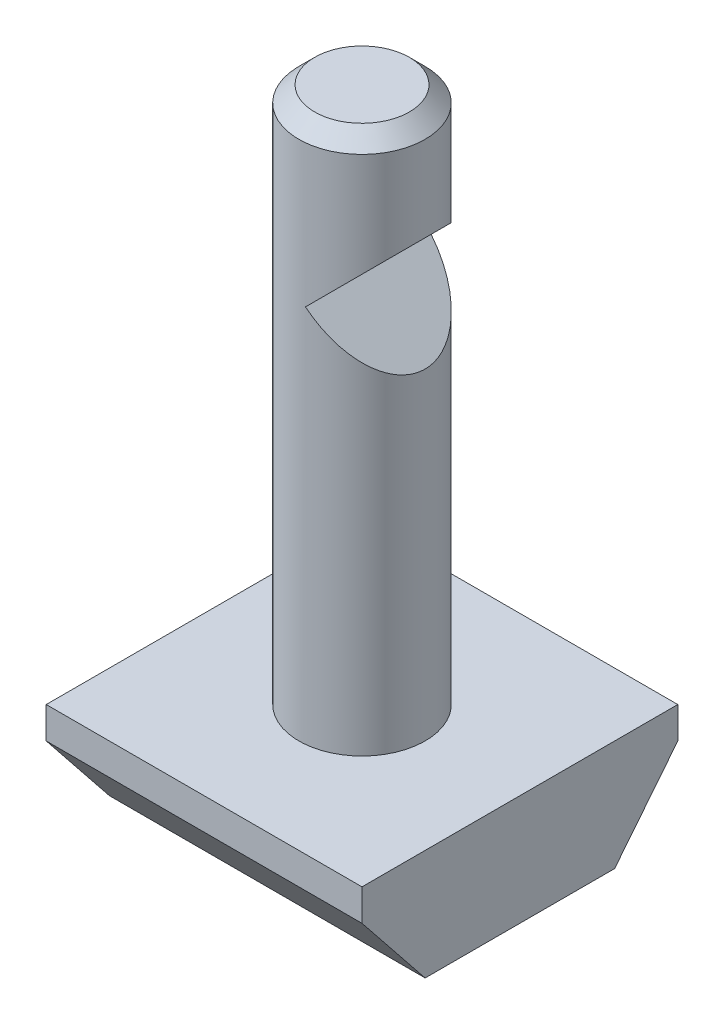
ISO-10303-21;
HEADER;
FILE_DESCRIPTION(('STEP AP214'),'2;1');
FILE_NAME('part.step','',(''),(''),'','','');
FILE_SCHEMA(('AUTOMOTIVE_DESIGN { 1 0 10303 214 1 1 1 1 }'));
ENDSEC;
DATA;
#1=APPLICATION_CONTEXT('core data for automotive mechanical design processes');
#2=APPLICATION_PROTOCOL_DEFINITION('international standard','automotive_design',2000,#1);
#3=PRODUCT_CONTEXT('',#1,'mechanical');
#4=PRODUCT('Part','Part','',(#3));
#5=PRODUCT_RELATED_PRODUCT_CATEGORY('part','',(#4));
#6=PRODUCT_DEFINITION_FORMATION('','',#4);
#7=PRODUCT_DEFINITION_CONTEXT('part definition',#1,'design');
#8=PRODUCT_DEFINITION('design','',#6,#7);
#9=PRODUCT_DEFINITION_SHAPE('','',#8);
#10=(LENGTH_UNIT() NAMED_UNIT(*) SI_UNIT(.MILLI.,.METRE.));
#11=(NAMED_UNIT(*) PLANE_ANGLE_UNIT() SI_UNIT($,.RADIAN.));
#12=(NAMED_UNIT(*) SI_UNIT($,.STERADIAN.) SOLID_ANGLE_UNIT());
#13=UNCERTAINTY_MEASURE_WITH_UNIT(LENGTH_MEASURE(1.E-05),#10,'distance_accuracy_value','');
#14=(GEOMETRIC_REPRESENTATION_CONTEXT(3) GLOBAL_UNCERTAINTY_ASSIGNED_CONTEXT((#13)) GLOBAL_UNIT_ASSIGNED_CONTEXT((#10,
#11,#12)) REPRESENTATION_CONTEXT('',''));
#15=CARTESIAN_POINT('',(0.,0.,0.));
#16=DIRECTION('',(0.,0.,1.));
#17=DIRECTION('',(1.,0.,0.));
#18=AXIS2_PLACEMENT_3D('',#15,#16,#17);
#19=CARTESIAN_POINT('',(5.,-1.,-5.));
#20=DIRECTION('',(0.,0.624695047554424,0.78086880944303));
#21=DIRECTION('',(0.,-0.78086880944303,0.624695047554424));
#22=AXIS2_PLACEMENT_3D('',#19,#20,#21);
#23=PLANE('',#22);
#24=DIRECTION('',(1.,0.,0.));
#25=VECTOR('',#24,1.);
#26=CARTESIAN_POINT('',(5.,-1.,-5.));
#27=LINE('',#26,#25);
#28=CARTESIAN_POINT('',(-5.,-1.,-5.));
#29=VERTEX_POINT('',#28);
#30=CARTESIAN_POINT('',(5.,-1.,-5.));
#31=VERTEX_POINT('',#30);
#32=EDGE_CURVE('E79',#29,#31,#27,.T.);
#33=ORIENTED_EDGE('',*,*,#32,.T.);
#34=DIRECTION('',(0.,-0.78086880944303,0.624695047554424));
#35=VECTOR('',#34,1.);
#36=CARTESIAN_POINT('',(5.,-1.,-5.));
#37=LINE('',#36,#35);
#38=CARTESIAN_POINT('',(5.,-3.5,-3.));
#39=VERTEX_POINT('',#38);
#40=EDGE_CURVE('E98',#31,#39,#37,.T.);
#41=ORIENTED_EDGE('',*,*,#40,.T.);
#42=DIRECTION('',(1.,0.,0.));
#43=VECTOR('',#42,1.);
#44=CARTESIAN_POINT('',(5.,-3.5,-3.));
#45=LINE('',#44,#43);
#46=CARTESIAN_POINT('',(-5.,-3.5,-3.));
#47=VERTEX_POINT('',#46);
#48=EDGE_CURVE('E91',#39,#47,#45,.F.);
#49=ORIENTED_EDGE('',*,*,#48,.T.);
#50=DIRECTION('',(0.,-0.78086880944303,0.624695047554424));
#51=VECTOR('',#50,1.);
#52=CARTESIAN_POINT('',(-5.,-1.,-5.));
#53=LINE('',#52,#51);
#54=EDGE_CURVE('E114',#29,#47,#53,.T.);
#55=ORIENTED_EDGE('',*,*,#54,.F.);
#56=EDGE_LOOP('',(#33,#41,#49,#55));
#57=FACE_BOUND('',#56,.T.);
#58=ADVANCED_FACE('F15',(#57),#23,.F.);
#59=CARTESIAN_POINT('',(5.,-3.5,-3.));
#60=DIRECTION('',(0.,1.,0.));
#61=DIRECTION('',(0.,0.,1.));
#62=AXIS2_PLACEMENT_3D('',#59,#60,#61);
#63=PLANE('',#62);
#64=ORIENTED_EDGE('',*,*,#48,.F.);
#65=DIRECTION('',(0.,0.,1.));
#66=VECTOR('',#65,1.);
#67=CARTESIAN_POINT('',(5.,-3.5,0.));
#68=LINE('',#67,#66);
#69=CARTESIAN_POINT('',(5.,-3.5,3.));
#70=VERTEX_POINT('',#69);
#71=EDGE_CURVE('E100',#39,#70,#68,.T.);
#72=ORIENTED_EDGE('',*,*,#71,.T.);
#73=DIRECTION('',(1.,0.,0.));
#74=VECTOR('',#73,1.);
#75=CARTESIAN_POINT('',(5.,-3.5,3.));
#76=LINE('',#75,#74);
#77=CARTESIAN_POINT('',(-5.,-3.5,3.));
#78=VERTEX_POINT('',#77);
#79=EDGE_CURVE('E80',#70,#78,#76,.F.);
#80=ORIENTED_EDGE('',*,*,#79,.T.);
#81=DIRECTION('',(0.,0.,1.));
#82=VECTOR('',#81,1.);
#83=CARTESIAN_POINT('',(-5.,-3.5,0.));
#84=LINE('',#83,#82);
#85=EDGE_CURVE('E117',#47,#78,#84,.T.);
#86=ORIENTED_EDGE('',*,*,#85,.F.);
#87=EDGE_LOOP('',(#64,#72,#80,#86));
#88=FACE_BOUND('',#87,.T.);
#89=ADVANCED_FACE('F150',(#88),#63,.F.);
#90=CARTESIAN_POINT('',(5.,-3.5,3.));
#91=DIRECTION('',(0.,0.624695047554424,-0.78086880944303));
#92=DIRECTION('',(0.,0.78086880944303,0.624695047554424));
#93=AXIS2_PLACEMENT_3D('',#90,#91,#92);
#94=PLANE('',#93);
#95=ORIENTED_EDGE('',*,*,#79,.F.);
#96=DIRECTION('',(0.,0.78086880944303,0.624695047554425));
#97=VECTOR('',#96,1.);
#98=CARTESIAN_POINT('',(5.,-3.5,3.));
#99=LINE('',#98,#97);
#100=CARTESIAN_POINT('',(5.,-1.,5.));
#101=VERTEX_POINT('',#100);
#102=EDGE_CURVE('E102',#70,#101,#99,.T.);
#103=ORIENTED_EDGE('',*,*,#102,.T.);
#104=DIRECTION('',(-1.,0.,0.));
#105=VECTOR('',#104,1.);
#106=CARTESIAN_POINT('',(5.,-1.,5.));
#107=LINE('',#106,#105);
#108=CARTESIAN_POINT('',(-5.,-1.,5.));
#109=VERTEX_POINT('',#108);
#110=EDGE_CURVE('E107',#101,#109,#107,.T.);
#111=ORIENTED_EDGE('',*,*,#110,.T.);
#112=DIRECTION('',(0.,0.78086880944303,0.624695047554425));
#113=VECTOR('',#112,1.);
#114=CARTESIAN_POINT('',(-5.,-3.5,3.));
#115=LINE('',#114,#113);
#116=EDGE_CURVE('E89',#78,#109,#115,.T.);
#117=ORIENTED_EDGE('',*,*,#116,.F.);
#118=EDGE_LOOP('',(#95,#103,#111,#117));
#119=FACE_BOUND('',#118,.T.);
#120=ADVANCED_FACE('F154',(#119),#94,.F.);
#121=CARTESIAN_POINT('',(0.,17.,0.));
#122=DIRECTION('',(0.,1.,0.));
#123=DIRECTION('',(0.,0.,1.));
#124=AXIS2_PLACEMENT_3D('',#121,#122,#123);
#125=PLANE('',#124);
#126=CARTESIAN_POINT('',(0.,16.9999999999959,0.));
#127=DIRECTION('',(0.,-1.,0.));
#128=DIRECTION('',(0.,0.,-1.));
#129=AXIS2_PLACEMENT_3D('',#126,#127,#128);
#130=CIRCLE('',#129,1.49999999996453);
#131=CARTESIAN_POINT('',(0.,16.9999999999959,-1.49999999996453));
#132=VERTEX_POINT('',#131);
#133=EDGE_CURVE('E18',#132,#132,#130,.T.);
#134=ORIENTED_EDGE('',*,*,#133,.F.);
#135=EDGE_LOOP('',(#134));
#136=FACE_BOUND('',#135,.T.);
#137=ADVANCED_FACE('F185',(#136),#125,.T.);
#138=CARTESIAN_POINT('',(2.,10.2,5.));
#139=DIRECTION('',(-0.707106781186547,-0.707106781186548,0.));
#140=DIRECTION('',(0.707106781186548,-0.707106781186547,0.));
#141=AXIS2_PLACEMENT_3D('',#138,#139,#140);
#142=PLANE('',#141);
#143=DIRECTION('',(0.,0.,1.));
#144=VECTOR('',#143,1.);
#145=CARTESIAN_POINT('',(0.2,12.,5.));
#146=LINE('',#145,#144);
#147=CARTESIAN_POINT('',(0.2,12.,-1.98997487421324));
#148=VERTEX_POINT('',#147);
#149=CARTESIAN_POINT('',(0.2,12.,1.98997487421324));
#150=VERTEX_POINT('',#149);
#151=EDGE_CURVE('E74',#148,#150,#146,.T.);
#152=ORIENTED_EDGE('',*,*,#151,.T.);
#153=CARTESIAN_POINT('',(0.,12.2,0.));
#154=DIRECTION('',(-0.707106781186547,-0.707106781186548,0.));
#155=DIRECTION('',(0.707106781186548,-0.707106781186547,0.));
#156=AXIS2_PLACEMENT_3D('',#153,#154,#155);
#157=ELLIPSE('',#156,2.82842712474619,2.);
#158=EDGE_CURVE('E72',#148,#150,#157,.T.);
#159=ORIENTED_EDGE('',*,*,#158,.F.);
#160=EDGE_LOOP('',(#152,#159));
#161=FACE_BOUND('',#160,.T.);
#162=ADVANCED_FACE('F76',(#161),#142,.F.);
#163=CARTESIAN_POINT('',(0.2,12.,5.));
#164=DIRECTION('',(-0.707106781186547,0.707106781186548,0.));
#165=DIRECTION('',(-0.707106781186548,-0.707106781186547,0.));
#166=AXIS2_PLACEMENT_3D('',#163,#164,#165);
#167=PLANE('',#166);
#168=CARTESIAN_POINT('',(0.,11.8,0.));
#169=DIRECTION('',(-0.707106781186547,0.707106781186548,0.));
#170=DIRECTION('',(-0.707106781186548,-0.707106781186547,0.));
#171=AXIS2_PLACEMENT_3D('',#168,#169,#170);
#172=ELLIPSE('',#171,2.82842712474619,2.);
#173=EDGE_CURVE('E82',#150,#148,#172,.T.);
#174=ORIENTED_EDGE('',*,*,#173,.F.);
#175=ORIENTED_EDGE('',*,*,#151,.F.);
#176=EDGE_LOOP('',(#174,#175));
#177=FACE_BOUND('',#176,.T.);
#178=ADVANCED_FACE('F83',(#177),#167,.F.);
#179=CARTESIAN_POINT('',(5.,0.,-5.));
#180=DIRECTION('',(0.,0.,1.));
#181=DIRECTION('',(1.,0.,0.));
#182=AXIS2_PLACEMENT_3D('',#179,#180,#181);
#183=PLANE('',#182);
#184=DIRECTION('',(1.,0.,0.));
#185=VECTOR('',#184,1.);
#186=CARTESIAN_POINT('',(5.,0.,-5.));
#187=LINE('',#186,#185);
#188=CARTESIAN_POINT('',(-5.,0.,-5.));
#189=VERTEX_POINT('',#188);
#190=CARTESIAN_POINT('',(5.,0.,-5.));
#191=VERTEX_POINT('',#190);
#192=EDGE_CURVE('E85',#189,#191,#187,.T.);
#193=ORIENTED_EDGE('',*,*,#192,.T.);
#194=DIRECTION('',(0.,1.,0.));
#195=VECTOR('',#194,1.);
#196=CARTESIAN_POINT('',(5.,0.,-5.));
#197=LINE('',#196,#195);
#198=EDGE_CURVE('E95',#191,#31,#197,.F.);
#199=ORIENTED_EDGE('',*,*,#198,.T.);
#200=ORIENTED_EDGE('',*,*,#32,.F.);
#201=DIRECTION('',(0.,1.,0.));
#202=VECTOR('',#201,1.);
#203=CARTESIAN_POINT('',(-5.,0.,-5.));
#204=LINE('',#203,#202);
#205=EDGE_CURVE('E111',#189,#29,#204,.F.);
#206=ORIENTED_EDGE('',*,*,#205,.F.);
#207=EDGE_LOOP('',(#193,#199,#200,#206));
#208=FACE_BOUND('',#207,.T.);
#209=ADVANCED_FACE('F139',(#208),#183,.F.);
#210=CARTESIAN_POINT('',(5.,0.,0.));
#211=DIRECTION('',(-1.,0.,0.));
#212=DIRECTION('',(0.,0.,1.));
#213=AXIS2_PLACEMENT_3D('',#210,#211,#212);
#214=PLANE('',#213);
#215=ORIENTED_EDGE('',*,*,#102,.F.);
#216=ORIENTED_EDGE('',*,*,#71,.F.);
#217=ORIENTED_EDGE('',*,*,#40,.F.);
#218=ORIENTED_EDGE('',*,*,#198,.F.);
#219=DIRECTION('',(0.,0.,-1.));
#220=VECTOR('',#219,1.);
#221=CARTESIAN_POINT('',(5.,0.,5.));
#222=LINE('',#221,#220);
#223=CARTESIAN_POINT('',(5.,0.,5.));
#224=VERTEX_POINT('',#223);
#225=EDGE_CURVE('E126',#191,#224,#222,.F.);
#226=ORIENTED_EDGE('',*,*,#225,.T.);
#227=DIRECTION('',(0.,1.,0.));
#228=VECTOR('',#227,1.);
#229=CARTESIAN_POINT('',(5.,-1.,5.));
#230=LINE('',#229,#228);
#231=EDGE_CURVE('E104',#224,#101,#230,.F.);
#232=ORIENTED_EDGE('',*,*,#231,.T.);
#233=EDGE_LOOP('',(#215,#216,#217,#218,#226,#232));
#234=FACE_BOUND('',#233,.T.);
#235=ADVANCED_FACE('F143',(#234),#214,.F.);
#236=CARTESIAN_POINT('',(5.,-1.,5.));
#237=DIRECTION('',(0.,0.,-1.));
#238=DIRECTION('',(-1.,0.,0.));
#239=AXIS2_PLACEMENT_3D('',#236,#237,#238);
#240=PLANE('',#239);
#241=ORIENTED_EDGE('',*,*,#110,.F.);
#242=ORIENTED_EDGE('',*,*,#231,.F.);
#243=DIRECTION('',(1.,0.,0.));
#244=VECTOR('',#243,1.);
#245=CARTESIAN_POINT('',(5.,0.,5.));
#246=LINE('',#245,#244);
#247=CARTESIAN_POINT('',(-5.,0.,5.));
#248=VERTEX_POINT('',#247);
#249=EDGE_CURVE('E33',#224,#248,#246,.F.);
#250=ORIENTED_EDGE('',*,*,#249,.T.);
#251=DIRECTION('',(0.,1.,0.));
#252=VECTOR('',#251,1.);
#253=CARTESIAN_POINT('',(-5.,0.,5.));
#254=LINE('',#253,#252);
#255=EDGE_CURVE('E109',#109,#248,#254,.T.);
#256=ORIENTED_EDGE('',*,*,#255,.F.);
#257=EDGE_LOOP('',(#241,#242,#250,#256));
#258=FACE_BOUND('',#257,.T.);
#259=ADVANCED_FACE('F156',(#258),#240,.F.);
#260=CARTESIAN_POINT('',(-5.,0.,0.));
#261=DIRECTION('',(-1.,0.,0.));
#262=DIRECTION('',(0.,0.,1.));
#263=AXIS2_PLACEMENT_3D('',#260,#261,#262);
#264=PLANE('',#263);
#265=ORIENTED_EDGE('',*,*,#85,.T.);
#266=ORIENTED_EDGE('',*,*,#116,.T.);
#267=ORIENTED_EDGE('',*,*,#255,.T.);
#268=DIRECTION('',(0.,0.,-1.));
#269=VECTOR('',#268,1.);
#270=CARTESIAN_POINT('',(-5.,0.,5.));
#271=LINE('',#270,#269);
#272=EDGE_CURVE('E124',#248,#189,#271,.T.);
#273=ORIENTED_EDGE('',*,*,#272,.T.);
#274=ORIENTED_EDGE('',*,*,#205,.T.);
#275=ORIENTED_EDGE('',*,*,#54,.T.);
#276=EDGE_LOOP('',(#265,#266,#267,#273,#274,#275));
#277=FACE_BOUND('',#276,.T.);
#278=ADVANCED_FACE('F133',(#277),#264,.T.);
#279=CARTESIAN_POINT('',(0.,16.5000000000077,0.));
#280=DIRECTION('',(0.,-1.,0.));
#281=DIRECTION('',(0.,0.,-1.));
#282=AXIS2_PLACEMENT_3D('',#279,#280,#281);
#283=CONICAL_SURFACE('',#282,1.99999999995271,0.785398163397448);
#284=ORIENTED_EDGE('',*,*,#133,.T.);
#285=EDGE_LOOP('',(#284));
#286=FACE_BOUND('',#285,.T.);
#287=CARTESIAN_POINT('',(0.,16.5,0.));
#288=DIRECTION('',(0.,-1.,0.));
#289=DIRECTION('',(0.,0.,-1.));
#290=AXIS2_PLACEMENT_3D('',#287,#288,#289);
#291=CIRCLE('',#290,2.);
#292=CARTESIAN_POINT('',(0.,16.5,-2.));
#293=VERTEX_POINT('',#292);
#294=EDGE_CURVE('E24',#293,#293,#291,.T.);
#295=ORIENTED_EDGE('',*,*,#294,.F.);
#296=EDGE_LOOP('',(#295));
#297=FACE_BOUND('',#296,.T.);
#298=ADVANCED_FACE('F164',(#286,#297),#283,.T.);
#299=CARTESIAN_POINT('',(5.,0.,5.));
#300=DIRECTION('',(0.,-1.,0.));
#301=DIRECTION('',(0.,0.,-1.));
#302=AXIS2_PLACEMENT_3D('',#299,#300,#301);
#303=PLANE('',#302);
#304=CARTESIAN_POINT('',(0.,0.,0.));
#305=DIRECTION('',(0.,-1.,0.));
#306=DIRECTION('',(0.,0.,-1.));
#307=AXIS2_PLACEMENT_3D('',#304,#305,#306);
#308=CIRCLE('',#307,2.);
#309=CARTESIAN_POINT('',(0.,0.,-2.));
#310=VERTEX_POINT('',#309);
#311=EDGE_CURVE('E10',#310,#310,#308,.F.);
#312=ORIENTED_EDGE('',*,*,#311,.F.);
#313=EDGE_LOOP('',(#312));
#314=FACE_BOUND('',#313,.T.);
#315=ORIENTED_EDGE('',*,*,#249,.F.);
#316=ORIENTED_EDGE('',*,*,#225,.F.);
#317=ORIENTED_EDGE('',*,*,#192,.F.);
#318=ORIENTED_EDGE('',*,*,#272,.F.);
#319=EDGE_LOOP('',(#315,#316,#317,#318));
#320=FACE_BOUND('',#319,.T.);
#321=ADVANCED_FACE('F136',(#314,#320),#303,.F.);
#322=CARTESIAN_POINT('',(0.,17.,0.));
#323=DIRECTION('',(0.,-1.,0.));
#324=DIRECTION('',(0.,0.,-1.));
#325=AXIS2_PLACEMENT_3D('',#322,#323,#324);
#326=CYLINDRICAL_SURFACE('',#325,2.);
#327=ORIENTED_EDGE('',*,*,#294,.T.);
#328=EDGE_LOOP('',(#327));
#329=FACE_BOUND('',#328,.T.);
#330=ORIENTED_EDGE('',*,*,#311,.T.);
#331=EDGE_LOOP('',(#330));
#332=FACE_BOUND('',#331,.T.);
#333=ORIENTED_EDGE('',*,*,#158,.T.);
#334=ORIENTED_EDGE('',*,*,#173,.T.);
#335=EDGE_LOOP('',(#333,#334));
#336=FACE_BOUND('',#335,.T.);
#337=ADVANCED_FACE('F87',(#329,#332,#336),#326,.T.);
#338=CLOSED_SHELL('',(#58,#89,#120,#137,#162,#178,#209,#235,#259,#278,#298,#321,#337));
#339=MANIFOLD_SOLID_BREP('B1',#338);
#340=ADVANCED_BREP_SHAPE_REPRESENTATION('',(#18,#339),#14);
#341=SHAPE_DEFINITION_REPRESENTATION(#9,#340);
ENDSEC;
END-ISO-10303-21;
